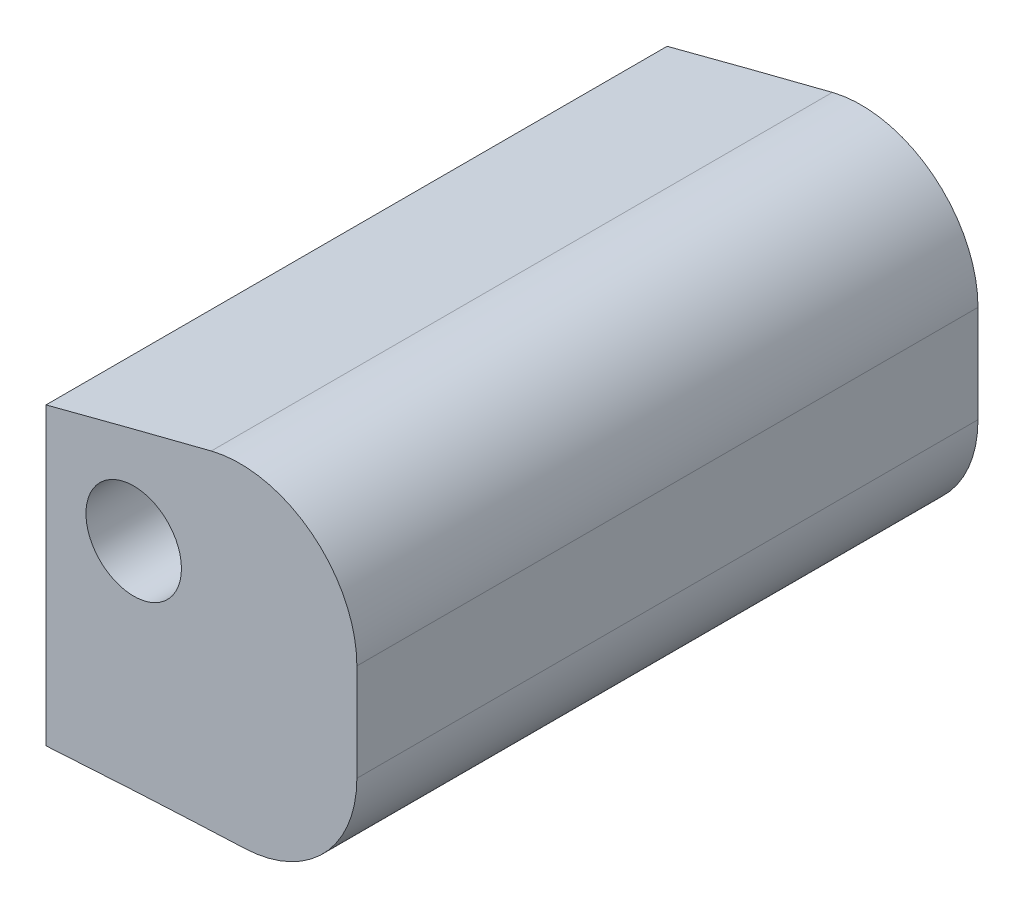
ISO-10303-21;
HEADER;
FILE_DESCRIPTION(('STEP AP214'),'2;1');
FILE_NAME('part.step','',(''),(''),'','','');
FILE_SCHEMA(('AUTOMOTIVE_DESIGN { 1 0 10303 214 1 1 1 1 }'));
ENDSEC;
DATA;
#1=APPLICATION_CONTEXT('core data for automotive mechanical design processes');
#2=APPLICATION_PROTOCOL_DEFINITION('international standard','automotive_design',2000,#1);
#3=PRODUCT_CONTEXT('',#1,'mechanical');
#4=PRODUCT('Part','Part','',(#3));
#5=PRODUCT_RELATED_PRODUCT_CATEGORY('part','',(#4));
#6=PRODUCT_DEFINITION_FORMATION('','',#4);
#7=PRODUCT_DEFINITION_CONTEXT('part definition',#1,'design');
#8=PRODUCT_DEFINITION('design','',#6,#7);
#9=PRODUCT_DEFINITION_SHAPE('','',#8);
#10=(LENGTH_UNIT() NAMED_UNIT(*) SI_UNIT(.MILLI.,.METRE.));
#11=(NAMED_UNIT(*) PLANE_ANGLE_UNIT() SI_UNIT($,.RADIAN.));
#12=(NAMED_UNIT(*) SI_UNIT($,.STERADIAN.) SOLID_ANGLE_UNIT());
#13=UNCERTAINTY_MEASURE_WITH_UNIT(LENGTH_MEASURE(1.E-05),#10,'distance_accuracy_value','');
#14=(GEOMETRIC_REPRESENTATION_CONTEXT(3) GLOBAL_UNCERTAINTY_ASSIGNED_CONTEXT((#13)) GLOBAL_UNIT_ASSIGNED_CONTEXT((#10,
#11,#12)) REPRESENTATION_CONTEXT('',''));
#15=CARTESIAN_POINT('',(0.,0.,0.));
#16=DIRECTION('',(0.,0.,1.));
#17=DIRECTION('',(1.,0.,0.));
#18=AXIS2_PLACEMENT_3D('',#15,#16,#17);
#19=CARTESIAN_POINT('',(-3.38585804489437,2.84943110783431,26.9875));
#20=DIRECTION('',(0.,0.,-1.));
#21=DIRECTION('',(-1.,0.,0.));
#22=AXIS2_PLACEMENT_3D('',#19,#20,#21);
#23=PLANE('',#22);
#24=CARTESIAN_POINT('',(29.7604148326359,12.1525264284107,26.9875));
#25=CARTESIAN_POINT('',(20.1045505491416,9.70736649048212,26.9875));
#26=CARTESIAN_POINT('',(4.16063491898357,5.36122778090482,26.9875));
#27=CARTESIAN_POINT('',(-17.3533003307906,-1.59933257097172,26.9875));
#28=CARTESIAN_POINT('',(-25.5735992764857,-4.86004973818616,26.9875));
#29=CARTESIAN_POINT('',(-35.7723904353696,-8.54907856294195,26.9875));
#30=CARTESIAN_POINT('',(-32.0293236620401,-8.16026846793183,26.9875));
#31=B_SPLINE_CURVE_WITH_KNOTS('',3,(#24,#25,#26,#27,#28,#29,#30),.UNSPECIFIED.,.F.,.F.,(4,1,1,1,
4),(0.330745029481521,0.630725310694853,0.824213609270468,0.940085476785923,1.),.UNSPECIFIED.);
#32=CARTESIAN_POINT('',(29.7604148326359,12.1525264284107,26.9875));
#33=VERTEX_POINT('',#32);
#34=CARTESIAN_POINT('',(22.5806763379599,10.2976716032387,26.9875));
#35=VERTEX_POINT('',#34);
#36=EDGE_CURVE('E107',#33,#35,#31,.T.);
#37=ORIENTED_EDGE('',*,*,#36,.T.);
#38=DIRECTION('',(0.,1.,0.));
#39=VECTOR('',#38,1.);
#40=CARTESIAN_POINT('',(22.5806763379599,14.1312873469022,26.9875));
#41=LINE('',#40,#39);
#42=CARTESIAN_POINT('',(22.5806763379599,-2.53154311993542,26.9875));
#43=VERTEX_POINT('',#42);
#44=EDGE_CURVE('E101',#43,#35,#41,.T.);
#45=ORIENTED_EDGE('',*,*,#44,.F.);
#46=CARTESIAN_POINT('',(-32.0293236620401,-8.16026846793183,26.9875));
#47=CARTESIAN_POINT('',(-27.5942778112262,-7.05268356637686,26.9875));
#48=CARTESIAN_POINT('',(-20.0884437398683,-6.58346117430725,26.9875));
#49=CARTESIAN_POINT('',(-6.74033236903934,-4.76096527535039,26.9875));
#50=CARTESIAN_POINT('',(4.86973223384492,-4.0725924276377,26.9875));
#51=CARTESIAN_POINT('',(18.4944774101649,-2.74271306174921,26.9875));
#52=CARTESIAN_POINT('',(26.2047401626103,-2.28716216190382,26.9875));
#53=CARTESIAN_POINT('',(31.221571849905,-2.07552801272788,26.9875));
#54=B_SPLINE_CURVE_WITH_KNOTS('',3,(#46,#47,#48,#49,#50,#51,#52,#53),.UNSPECIFIED.,.F.,.F.,(4,1,
1,1,1,4),(0.,0.144322392153104,0.23794765175378,0.427122749709389,0.512831912207282,
0.672024739524669),.UNSPECIFIED.);
#55=CARTESIAN_POINT('',(31.221571849905,-2.07552801272788,26.9875));
#56=VERTEX_POINT('',#55);
#57=EDGE_CURVE('E92',#43,#56,#54,.T.);
#58=ORIENTED_EDGE('',*,*,#57,.T.);
#59=CARTESIAN_POINT('',(31.007463381397,2.99995793087527,26.9875));
#60=DIRECTION('',(0.,0.,1.));
#61=DIRECTION('',(1.,0.,0.));
#62=AXIS2_PLACEMENT_3D('',#59,#60,#61);
#63=CIRCLE('',#62,5.08000000000001);
#64=CARTESIAN_POINT('',(36.0874633813971,2.99995793087527,26.9875));
#65=VERTEX_POINT('',#64);
#66=EDGE_CURVE('E114',#56,#65,#63,.T.);
#67=ORIENTED_EDGE('',*,*,#66,.T.);
#68=DIRECTION('',(0.,1.,0.));
#69=VECTOR('',#68,1.);
#70=CARTESIAN_POINT('',(36.0874633813971,2.99995793087527,26.9875));
#71=LINE('',#70,#69);
#72=CARTESIAN_POINT('',(36.0874633813971,7.22796858866175,26.9875));
#73=VERTEX_POINT('',#72);
#74=EDGE_CURVE('E118',#65,#73,#71,.T.);
#75=ORIENTED_EDGE('',*,*,#74,.T.);
#76=CARTESIAN_POINT('',(31.0074633813971,7.22796858866175,26.9875));
#77=DIRECTION('',(0.,0.,1.));
#78=DIRECTION('',(1.,0.,0.));
#79=AXIS2_PLACEMENT_3D('',#76,#77,#78);
#80=CIRCLE('',#79,5.08);
#81=EDGE_CURVE('E64',#73,#33,#80,.T.);
#82=ORIENTED_EDGE('',*,*,#81,.T.);
#83=EDGE_LOOP('',(#37,#45,#58,#67,#75,#82));
#84=FACE_BOUND('',#83,.T.);
#85=CARTESIAN_POINT('',(26.3906763379599,7.07973153206817,26.9875));
#86=DIRECTION('',(0.,0.,1.));
#87=DIRECTION('',(1.,0.,0.));
#88=AXIS2_PLACEMENT_3D('',#85,#86,#87);
#89=CIRCLE('',#88,2.07499999999999);
#90=CARTESIAN_POINT('',(28.4656763379598,7.07973153206817,26.9875));
#91=VERTEX_POINT('',#90);
#92=EDGE_CURVE('E218',#91,#91,#89,.T.);
#93=ORIENTED_EDGE('',*,*,#92,.F.);
#94=EDGE_LOOP('',(#93));
#95=FACE_BOUND('',#94,.T.);
#96=ADVANCED_FACE('F39',(#84,#95),#23,.F.);
#97=CARTESIAN_POINT('',(-3.38585804489437,2.84943110783431,0.));
#98=DIRECTION('',(0.,0.,-1.));
#99=DIRECTION('',(-1.,0.,0.));
#100=AXIS2_PLACEMENT_3D('',#97,#98,#99);
#101=PLANE('',#100);
#102=DIRECTION('',(0.,1.,0.));
#103=VECTOR('',#102,1.);
#104=CARTESIAN_POINT('',(22.5806763379599,14.1312873469022,0.));
#105=LINE('',#104,#103);
#106=CARTESIAN_POINT('',(22.5806763365085,-2.53154311993542,0.));
#107=VERTEX_POINT('',#106);
#108=CARTESIAN_POINT('',(22.5806763379599,10.2976716032387,0.));
#109=VERTEX_POINT('',#108);
#110=EDGE_CURVE('E56',#107,#109,#105,.T.);
#111=ORIENTED_EDGE('',*,*,#110,.T.);
#112=CARTESIAN_POINT('',(29.7604148326359,12.1525264284107,0.));
#113=CARTESIAN_POINT('',(20.1045505491416,9.70736649048212,0.));
#114=CARTESIAN_POINT('',(4.16063491898357,5.36122778090482,0.));
#115=CARTESIAN_POINT('',(-17.3533003307906,-1.59933257097172,0.));
#116=CARTESIAN_POINT('',(-25.5735992764857,-4.86004973818616,0.));
#117=CARTESIAN_POINT('',(-35.7723904353696,-8.54907856294195,0.));
#118=CARTESIAN_POINT('',(-32.0293236620401,-8.16026846793183,0.));
#119=B_SPLINE_CURVE_WITH_KNOTS('',3,(#112,#113,#114,#115,#116,#117,#118),.UNSPECIFIED.,.F.,.F.,
(4,1,1,1,4),(0.330745029481521,0.630725310694853,0.824213609270468,0.940085476785923,1.),.UNSPECIFIED.);
#120=CARTESIAN_POINT('',(29.7604148326359,12.1525264284107,0.));
#121=VERTEX_POINT('',#120);
#122=EDGE_CURVE('E213',#121,#109,#119,.T.);
#123=ORIENTED_EDGE('',*,*,#122,.F.);
#124=CARTESIAN_POINT('',(31.0074633813971,7.22796858866175,0.));
#125=DIRECTION('',(0.,0.,1.));
#126=DIRECTION('',(1.,0.,0.));
#127=AXIS2_PLACEMENT_3D('',#124,#125,#126);
#128=CIRCLE('',#127,5.08);
#129=CARTESIAN_POINT('',(36.0874633813971,7.22796858866175,0.));
#130=VERTEX_POINT('',#129);
#131=EDGE_CURVE('E85',#130,#121,#128,.T.);
#132=ORIENTED_EDGE('',*,*,#131,.F.);
#133=DIRECTION('',(0.,1.,0.));
#134=VECTOR('',#133,1.);
#135=CARTESIAN_POINT('',(36.0874633813971,2.99995793087527,0.));
#136=LINE('',#135,#134);
#137=CARTESIAN_POINT('',(36.0874633813971,2.99995793087527,0.));
#138=VERTEX_POINT('',#137);
#139=EDGE_CURVE('E241',#138,#130,#136,.T.);
#140=ORIENTED_EDGE('',*,*,#139,.F.);
#141=CARTESIAN_POINT('',(31.007463381397,2.99995793087527,0.));
#142=DIRECTION('',(0.,0.,1.));
#143=DIRECTION('',(1.,0.,0.));
#144=AXIS2_PLACEMENT_3D('',#141,#142,#143);
#145=CIRCLE('',#144,5.08000000000001);
#146=CARTESIAN_POINT('',(31.221571849905,-2.07552801272788,0.));
#147=VERTEX_POINT('',#146);
#148=EDGE_CURVE('E222',#147,#138,#145,.T.);
#149=ORIENTED_EDGE('',*,*,#148,.F.);
#150=CARTESIAN_POINT('',(-32.0293236620401,-8.16026846793183,0.));
#151=CARTESIAN_POINT('',(-27.5942778112262,-7.05268356637686,0.));
#152=CARTESIAN_POINT('',(-20.0884437398683,-6.58346117430725,0.));
#153=CARTESIAN_POINT('',(-6.74033236903934,-4.76096527535039,0.));
#154=CARTESIAN_POINT('',(4.86973223384492,-4.0725924276377,0.));
#155=CARTESIAN_POINT('',(18.4944774101649,-2.74271306174921,0.));
#156=CARTESIAN_POINT('',(26.2047401626103,-2.28716216190382,0.));
#157=CARTESIAN_POINT('',(31.221571849905,-2.07552801272788,0.));
#158=B_SPLINE_CURVE_WITH_KNOTS('',3,(#150,#151,#152,#153,#154,#155,#156,#157),.UNSPECIFIED.,.F.,
.F.,(4,1,1,1,1,4),(0.,0.144322392153104,0.23794765175378,0.427122749709389,0.512831912207282,
0.672024739524669),.UNSPECIFIED.);
#159=EDGE_CURVE('E217',#107,#147,#158,.T.);
#160=ORIENTED_EDGE('',*,*,#159,.F.);
#161=EDGE_LOOP('',(#111,#123,#132,#140,#149,#160));
#162=FACE_BOUND('',#161,.T.);
#163=CARTESIAN_POINT('',(26.3906763379599,7.07973153206817,0.));
#164=DIRECTION('',(0.,0.,1.));
#165=DIRECTION('',(1.,0.,0.));
#166=AXIS2_PLACEMENT_3D('',#163,#164,#165);
#167=CIRCLE('',#166,2.07499999999999);
#168=CARTESIAN_POINT('',(28.4656763379598,7.07973153206817,0.));
#169=VERTEX_POINT('',#168);
#170=EDGE_CURVE('E225',#169,#169,#167,.T.);
#171=ORIENTED_EDGE('',*,*,#170,.T.);
#172=EDGE_LOOP('',(#171));
#173=FACE_BOUND('',#172,.T.);
#174=ADVANCED_FACE('F145',(#162,#173),#101,.T.);
#175=DIRECTION('',(0.,0.,-1.));
#176=VECTOR('',#175,1.);
#177=SURFACE_OF_LINEAR_EXTRUSION('',#31,#176);
#178=ORIENTED_EDGE('',*,*,#122,.T.);
#179=DIRECTION('',(0.,0.,-1.));
#180=VECTOR('',#179,1.);
#181=CARTESIAN_POINT('',(22.5806763379599,10.2976716010453,26.9875));
#182=LINE('',#181,#180);
#183=EDGE_CURVE('E214',#109,#35,#182,.F.);
#184=ORIENTED_EDGE('',*,*,#183,.T.);
#185=ORIENTED_EDGE('',*,*,#36,.F.);
#186=DIRECTION('',(0.,0.,-1.));
#187=VECTOR('',#186,1.);
#188=CARTESIAN_POINT('',(29.7604148326359,12.1525264284107,26.9875));
#189=LINE('',#188,#187);
#190=EDGE_CURVE('E215',#33,#121,#189,.T.);
#191=ORIENTED_EDGE('',*,*,#190,.T.);
#192=EDGE_LOOP('',(#178,#184,#185,#191));
#193=FACE_BOUND('',#192,.T.);
#194=ADVANCED_FACE('F41',(#193),#177,.F.);
#195=DIRECTION('',(0.,0.,-1.));
#196=VECTOR('',#195,1.);
#197=SURFACE_OF_LINEAR_EXTRUSION('',#54,#196);
#198=ORIENTED_EDGE('',*,*,#57,.F.);
#199=DIRECTION('',(0.,0.,-1.));
#200=VECTOR('',#199,1.);
#201=CARTESIAN_POINT('',(22.5806763379599,-2.53154311984214,26.9875));
#202=LINE('',#201,#200);
#203=EDGE_CURVE('E11',#43,#107,#202,.T.);
#204=ORIENTED_EDGE('',*,*,#203,.T.);
#205=ORIENTED_EDGE('',*,*,#159,.T.);
#206=DIRECTION('',(0.,0.,-1.));
#207=VECTOR('',#206,1.);
#208=CARTESIAN_POINT('',(31.221571849905,-2.07552801272788,26.9875));
#209=LINE('',#208,#207);
#210=EDGE_CURVE('E49',#56,#147,#209,.T.);
#211=ORIENTED_EDGE('',*,*,#210,.F.);
#212=EDGE_LOOP('',(#198,#204,#205,#211));
#213=FACE_BOUND('',#212,.T.);
#214=ADVANCED_FACE('F110',(#213),#197,.F.);
#215=CARTESIAN_POINT('',(31.007463381397,2.99995793087527,26.9875));
#216=DIRECTION('',(0.,0.,-1.));
#217=DIRECTION('',(-1.,0.,0.));
#218=AXIS2_PLACEMENT_3D('',#215,#216,#217);
#219=CYLINDRICAL_SURFACE('',#218,5.08000000000001);
#220=ORIENTED_EDGE('',*,*,#148,.T.);
#221=DIRECTION('',(0.,0.,-1.));
#222=VECTOR('',#221,1.);
#223=CARTESIAN_POINT('',(36.0874633813971,2.99995793087527,26.9875));
#224=LINE('',#223,#222);
#225=EDGE_CURVE('E251',#65,#138,#224,.T.);
#226=ORIENTED_EDGE('',*,*,#225,.F.);
#227=ORIENTED_EDGE('',*,*,#66,.F.);
#228=ORIENTED_EDGE('',*,*,#210,.T.);
#229=EDGE_LOOP('',(#220,#226,#227,#228));
#230=FACE_BOUND('',#229,.T.);
#231=ADVANCED_FACE('F133',(#230),#219,.T.);
#232=CARTESIAN_POINT('',(36.0874633813971,2.99995793087527,26.9875));
#233=DIRECTION('',(-1.,0.,0.));
#234=DIRECTION('',(0.,0.,1.));
#235=AXIS2_PLACEMENT_3D('',#232,#233,#234);
#236=PLANE('',#235);
#237=ORIENTED_EDGE('',*,*,#139,.T.);
#238=DIRECTION('',(0.,0.,-1.));
#239=VECTOR('',#238,1.);
#240=CARTESIAN_POINT('',(36.0874633813971,7.22796858866175,26.9875));
#241=LINE('',#240,#239);
#242=EDGE_CURVE('E248',#73,#130,#241,.T.);
#243=ORIENTED_EDGE('',*,*,#242,.F.);
#244=ORIENTED_EDGE('',*,*,#74,.F.);
#245=ORIENTED_EDGE('',*,*,#225,.T.);
#246=EDGE_LOOP('',(#237,#243,#244,#245));
#247=FACE_BOUND('',#246,.T.);
#248=ADVANCED_FACE('F136',(#247),#236,.F.);
#249=CARTESIAN_POINT('',(31.0074633813971,7.22796858866175,26.9875));
#250=DIRECTION('',(0.,0.,-1.));
#251=DIRECTION('',(-1.,0.,0.));
#252=AXIS2_PLACEMENT_3D('',#249,#250,#251);
#253=CYLINDRICAL_SURFACE('',#252,5.08);
#254=ORIENTED_EDGE('',*,*,#131,.T.);
#255=ORIENTED_EDGE('',*,*,#190,.F.);
#256=ORIENTED_EDGE('',*,*,#81,.F.);
#257=ORIENTED_EDGE('',*,*,#242,.T.);
#258=EDGE_LOOP('',(#254,#255,#256,#257));
#259=FACE_BOUND('',#258,.T.);
#260=ADVANCED_FACE('F140',(#259),#253,.T.);
#261=CARTESIAN_POINT('',(26.3906763379599,7.07973153206817,26.9875));
#262=DIRECTION('',(0.,0.,-1.));
#263=DIRECTION('',(-1.,0.,0.));
#264=AXIS2_PLACEMENT_3D('',#261,#262,#263);
#265=CYLINDRICAL_SURFACE('',#264,2.07499999999999);
#266=ORIENTED_EDGE('',*,*,#92,.T.);
#267=EDGE_LOOP('',(#266));
#268=FACE_BOUND('',#267,.T.);
#269=ORIENTED_EDGE('',*,*,#170,.F.);
#270=EDGE_LOOP('',(#269));
#271=FACE_BOUND('',#270,.T.);
#272=ADVANCED_FACE('F144',(#268,#271),#265,.F.);
#273=CARTESIAN_POINT('',(22.5806763379599,14.1312873469022,0.));
#274=DIRECTION('',(1.,0.,0.));
#275=DIRECTION('',(0.,0.,-1.));
#276=AXIS2_PLACEMENT_3D('',#273,#274,#275);
#277=PLANE('',#276);
#278=ORIENTED_EDGE('',*,*,#110,.F.);
#279=ORIENTED_EDGE('',*,*,#203,.F.);
#280=ORIENTED_EDGE('',*,*,#44,.T.);
#281=ORIENTED_EDGE('',*,*,#183,.F.);
#282=EDGE_LOOP('',(#278,#279,#280,#281));
#283=FACE_BOUND('',#282,.T.);
#284=ADVANCED_FACE('F100',(#283),#277,.F.);
#285=CLOSED_SHELL('',(#96,#174,#194,#214,#231,#248,#260,#272,#284));
#286=MANIFOLD_SOLID_BREP('B2',#285);
#287=ADVANCED_BREP_SHAPE_REPRESENTATION('',(#18,#286),#14);
#288=SHAPE_DEFINITION_REPRESENTATION(#9,#287);
ENDSEC;
END-ISO-10303-21;
